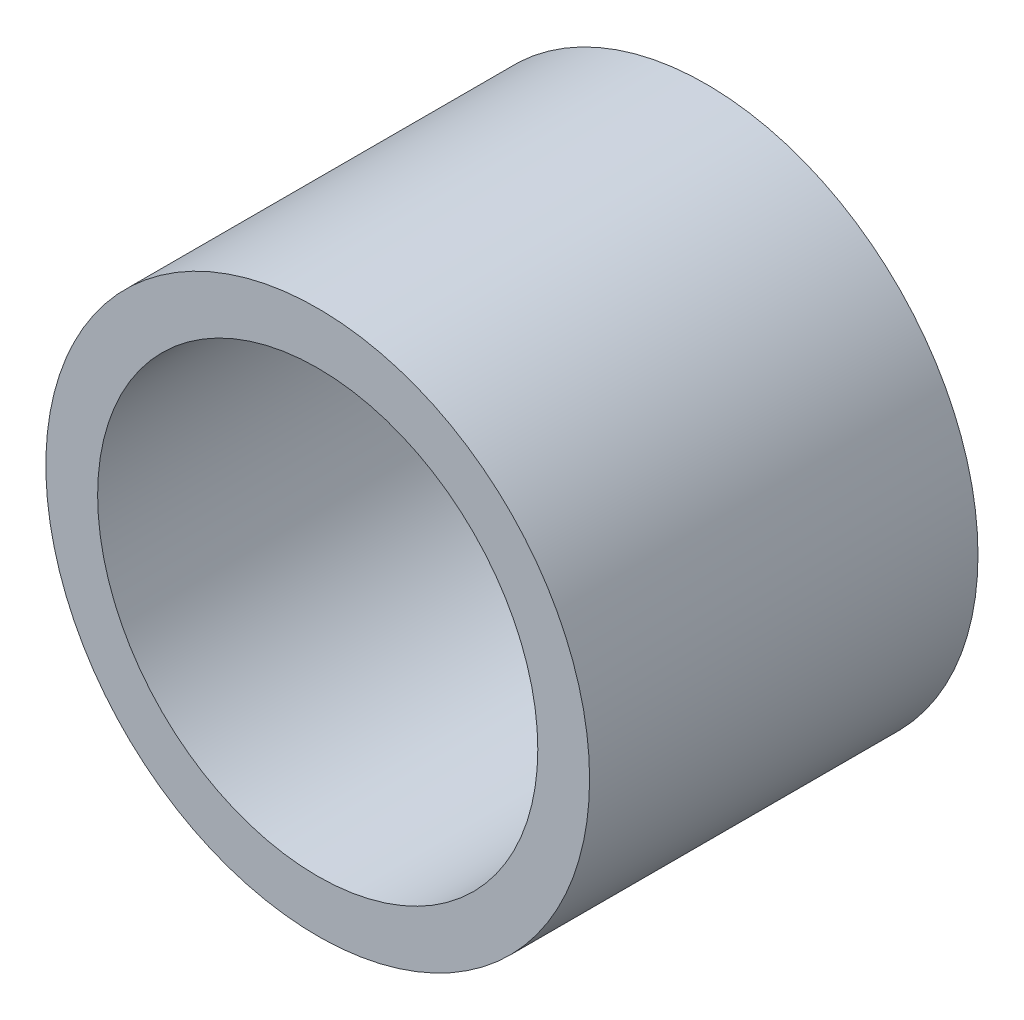
ISO-10303-21;
HEADER;
FILE_DESCRIPTION(('STEP AP214'),'2;1');
FILE_NAME('part.step','',(''),(''),'','','');
FILE_SCHEMA(('AUTOMOTIVE_DESIGN { 1 0 10303 214 1 1 1 1 }'));
ENDSEC;
DATA;
#1=APPLICATION_CONTEXT('core data for automotive mechanical design processes');
#2=APPLICATION_PROTOCOL_DEFINITION('international standard','automotive_design',2000,#1);
#3=PRODUCT_CONTEXT('',#1,'mechanical');
#4=PRODUCT('Part','Part','',(#3));
#5=PRODUCT_RELATED_PRODUCT_CATEGORY('part','',(#4));
#6=PRODUCT_DEFINITION_FORMATION('','',#4);
#7=PRODUCT_DEFINITION_CONTEXT('part definition',#1,'design');
#8=PRODUCT_DEFINITION('design','',#6,#7);
#9=PRODUCT_DEFINITION_SHAPE('','',#8);
#10=(LENGTH_UNIT() NAMED_UNIT(*) SI_UNIT(.MILLI.,.METRE.));
#11=(NAMED_UNIT(*) PLANE_ANGLE_UNIT() SI_UNIT($,.RADIAN.));
#12=(NAMED_UNIT(*) SI_UNIT($,.STERADIAN.) SOLID_ANGLE_UNIT());
#13=UNCERTAINTY_MEASURE_WITH_UNIT(LENGTH_MEASURE(1.E-05),#10,'distance_accuracy_value','');
#14=(GEOMETRIC_REPRESENTATION_CONTEXT(3) GLOBAL_UNCERTAINTY_ASSIGNED_CONTEXT((#13)) GLOBAL_UNIT_ASSIGNED_CONTEXT((#10,
#11,#12)) REPRESENTATION_CONTEXT('',''));
#15=CARTESIAN_POINT('',(0.,0.,0.));
#16=DIRECTION('',(0.,0.,1.));
#17=DIRECTION('',(1.,0.,0.));
#18=AXIS2_PLACEMENT_3D('',#15,#16,#17);
#19=CARTESIAN_POINT('',(0.,0.,30.));
#20=DIRECTION('',(0.,0.,-1.));
#21=DIRECTION('',(-1.,0.,0.));
#22=AXIS2_PLACEMENT_3D('',#19,#20,#21);
#23=CYLINDRICAL_SURFACE('',#22,21.);
#24=CARTESIAN_POINT('',(0.,0.,30.));
#25=DIRECTION('',(0.,0.,1.));
#26=DIRECTION('',(1.,0.,0.));
#27=AXIS2_PLACEMENT_3D('',#24,#25,#26);
#28=CIRCLE('',#27,21.);
#29=CARTESIAN_POINT('',(21.,0.,30.));
#30=VERTEX_POINT('',#29);
#31=EDGE_CURVE('E10',#30,#30,#28,.T.);
#32=ORIENTED_EDGE('',*,*,#31,.F.);
#33=EDGE_LOOP('',(#32));
#34=FACE_BOUND('',#33,.T.);
#35=CARTESIAN_POINT('',(0.,0.,0.));
#36=DIRECTION('',(0.,0.,1.));
#37=DIRECTION('',(1.,0.,0.));
#38=AXIS2_PLACEMENT_3D('',#35,#36,#37);
#39=CIRCLE('',#38,21.);
#40=CARTESIAN_POINT('',(21.,0.,0.));
#41=VERTEX_POINT('',#40);
#42=EDGE_CURVE('E20',#41,#41,#39,.T.);
#43=ORIENTED_EDGE('',*,*,#42,.T.);
#44=EDGE_LOOP('',(#43));
#45=FACE_BOUND('',#44,.T.);
#46=ADVANCED_FACE('F14',(#34,#45),#23,.T.);
#47=CARTESIAN_POINT('',(0.,0.,30.));
#48=DIRECTION('',(0.,0.,1.));
#49=DIRECTION('',(1.,0.,0.));
#50=AXIS2_PLACEMENT_3D('',#47,#48,#49);
#51=PLANE('',#50);
#52=CARTESIAN_POINT('',(0.,0.,30.));
#53=DIRECTION('',(0.,0.,1.));
#54=DIRECTION('',(1.,0.,0.));
#55=AXIS2_PLACEMENT_3D('',#52,#53,#54);
#56=CIRCLE('',#55,17.);
#57=CARTESIAN_POINT('',(17.,0.,30.));
#58=VERTEX_POINT('',#57);
#59=EDGE_CURVE('E28',#58,#58,#56,.T.);
#60=ORIENTED_EDGE('',*,*,#59,.F.);
#61=EDGE_LOOP('',(#60));
#62=FACE_BOUND('',#61,.T.);
#63=ORIENTED_EDGE('',*,*,#31,.T.);
#64=EDGE_LOOP('',(#63));
#65=FACE_BOUND('',#64,.T.);
#66=ADVANCED_FACE('F36',(#62,#65),#51,.T.);
#67=CARTESIAN_POINT('',(0.,0.,0.));
#68=DIRECTION('',(0.,0.,1.));
#69=DIRECTION('',(1.,0.,0.));
#70=AXIS2_PLACEMENT_3D('',#67,#68,#69);
#71=PLANE('',#70);
#72=CARTESIAN_POINT('',(0.,0.,0.));
#73=DIRECTION('',(0.,0.,1.));
#74=DIRECTION('',(1.,0.,0.));
#75=AXIS2_PLACEMENT_3D('',#72,#73,#74);
#76=CIRCLE('',#75,17.);
#77=CARTESIAN_POINT('',(17.,0.,0.));
#78=VERTEX_POINT('',#77);
#79=EDGE_CURVE('E24',#78,#78,#76,.T.);
#80=ORIENTED_EDGE('',*,*,#79,.T.);
#81=EDGE_LOOP('',(#80));
#82=FACE_BOUND('',#81,.T.);
#83=ORIENTED_EDGE('',*,*,#42,.F.);
#84=EDGE_LOOP('',(#83));
#85=FACE_BOUND('',#84,.T.);
#86=ADVANCED_FACE('F38',(#82,#85),#71,.F.);
#87=CARTESIAN_POINT('',(0.,0.,0.));
#88=DIRECTION('',(0.,0.,1.));
#89=DIRECTION('',(1.,0.,0.));
#90=AXIS2_PLACEMENT_3D('',#87,#88,#89);
#91=CYLINDRICAL_SURFACE('',#90,17.);
#92=ORIENTED_EDGE('',*,*,#79,.F.);
#93=EDGE_LOOP('',(#92));
#94=FACE_BOUND('',#93,.T.);
#95=ORIENTED_EDGE('',*,*,#59,.T.);
#96=EDGE_LOOP('',(#95));
#97=FACE_BOUND('',#96,.T.);
#98=ADVANCED_FACE('F34',(#94,#97),#91,.F.);
#99=CLOSED_SHELL('',(#46,#66,#86,#98));
#100=MANIFOLD_SOLID_BREP('B1',#99);
#101=ADVANCED_BREP_SHAPE_REPRESENTATION('',(#18,#100),#14);
#102=SHAPE_DEFINITION_REPRESENTATION(#9,#101);
ENDSEC;
END-ISO-10303-21;
